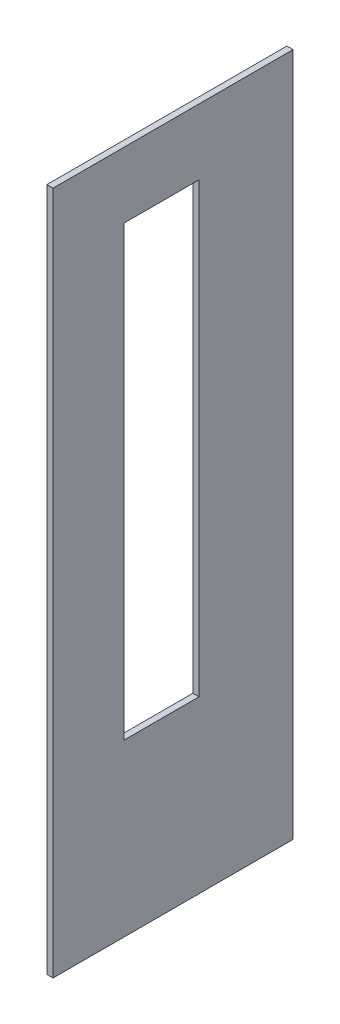
ISO-10303-21;
HEADER;
FILE_DESCRIPTION(('STEP AP214'),'2;1');
FILE_NAME('part.step','',(''),(''),'','','');
FILE_SCHEMA(('AUTOMOTIVE_DESIGN { 1 0 10303 214 1 1 1 1 }'));
ENDSEC;
DATA;
#1=APPLICATION_CONTEXT('core data for automotive mechanical design processes');
#2=APPLICATION_PROTOCOL_DEFINITION('international standard','automotive_design',2000,#1);
#3=PRODUCT_CONTEXT('',#1,'mechanical');
#4=PRODUCT('Part','Part','',(#3));
#5=PRODUCT_RELATED_PRODUCT_CATEGORY('part','',(#4));
#6=PRODUCT_DEFINITION_FORMATION('','',#4);
#7=PRODUCT_DEFINITION_CONTEXT('part definition',#1,'design');
#8=PRODUCT_DEFINITION('design','',#6,#7);
#9=PRODUCT_DEFINITION_SHAPE('','',#8);
#10=(LENGTH_UNIT() NAMED_UNIT(*) SI_UNIT(.MILLI.,.METRE.));
#11=(NAMED_UNIT(*) PLANE_ANGLE_UNIT() SI_UNIT($,.RADIAN.));
#12=(NAMED_UNIT(*) SI_UNIT($,.STERADIAN.) SOLID_ANGLE_UNIT());
#13=UNCERTAINTY_MEASURE_WITH_UNIT(LENGTH_MEASURE(1.E-05),#10,'distance_accuracy_value','');
#14=(GEOMETRIC_REPRESENTATION_CONTEXT(3) GLOBAL_UNCERTAINTY_ASSIGNED_CONTEXT((#13)) GLOBAL_UNIT_ASSIGNED_CONTEXT((#10,
#11,#12)) REPRESENTATION_CONTEXT('',''));
#15=CARTESIAN_POINT('',(0.,0.,0.));
#16=DIRECTION('',(0.,0.,1.));
#17=DIRECTION('',(1.,0.,0.));
#18=AXIS2_PLACEMENT_3D('',#15,#16,#17);
#19=CARTESIAN_POINT('',(1.5,0.,0.));
#20=DIRECTION('',(-1.,0.,0.));
#21=DIRECTION('',(0.,0.,1.));
#22=AXIS2_PLACEMENT_3D('',#19,#20,#21);
#23=PLANE('',#22);
#24=DIRECTION('',(0.,0.,1.));
#25=VECTOR('',#24,1.);
#26=CARTESIAN_POINT('',(1.5,-9.84999999999989,3.40000000000003));
#27=LINE('',#26,#25);
#28=CARTESIAN_POINT('',(1.5,-9.84999999999989,3.40000000000003));
#29=VERTEX_POINT('',#28);
#30=CARTESIAN_POINT('',(1.5,-9.84999999999989,42.25));
#31=VERTEX_POINT('',#30);
#32=EDGE_CURVE('E136',#29,#31,#27,.T.);
#33=ORIENTED_EDGE('',*,*,#32,.F.);
#34=DIRECTION('',(0.,-1.,0.));
#35=VECTOR('',#34,1.);
#36=CARTESIAN_POINT('',(1.5,100.85,3.40000000000002));
#37=LINE('',#36,#35);
#38=CARTESIAN_POINT('',(1.5,100.85,3.40000000000002));
#39=VERTEX_POINT('',#38);
#40=EDGE_CURVE('E146',#39,#29,#37,.T.);
#41=ORIENTED_EDGE('',*,*,#40,.F.);
#42=DIRECTION('',(0.,0.,-1.));
#43=VECTOR('',#42,1.);
#44=CARTESIAN_POINT('',(1.5,100.85,42.25));
#45=LINE('',#44,#43);
#46=CARTESIAN_POINT('',(1.5,100.85,42.25));
#47=VERTEX_POINT('',#46);
#48=EDGE_CURVE('E143',#47,#39,#45,.T.);
#49=ORIENTED_EDGE('',*,*,#48,.F.);
#50=DIRECTION('',(0.,1.,0.));
#51=VECTOR('',#50,1.);
#52=CARTESIAN_POINT('',(1.5,-9.84999999999989,42.25));
#53=LINE('',#52,#51);
#54=EDGE_CURVE('E139',#31,#47,#53,.T.);
#55=ORIENTED_EDGE('',*,*,#54,.F.);
#56=EDGE_LOOP('',(#33,#41,#49,#55));
#57=FACE_BOUND('',#56,.T.);
#58=DIRECTION('',(0.,0.,1.));
#59=VECTOR('',#58,1.);
#60=CARTESIAN_POINT('',(1.5,90.21,0.));
#61=LINE('',#60,#59);
#62=CARTESIAN_POINT('',(1.5,90.21,18.63));
#63=VERTEX_POINT('',#62);
#64=CARTESIAN_POINT('',(1.5,90.21,30.75));
#65=VERTEX_POINT('',#64);
#66=EDGE_CURVE('E101',#63,#65,#61,.T.);
#67=ORIENTED_EDGE('',*,*,#66,.F.);
#68=DIRECTION('',(0.,-1.,0.));
#69=VECTOR('',#68,1.);
#70=CARTESIAN_POINT('',(1.5,0.,18.63));
#71=LINE('',#70,#69);
#72=CARTESIAN_POINT('',(1.5,17.75,18.63));
#73=VERTEX_POINT('',#72);
#74=EDGE_CURVE('E104',#63,#73,#71,.T.);
#75=ORIENTED_EDGE('',*,*,#74,.T.);
#76=DIRECTION('',(0.,0.,1.));
#77=VECTOR('',#76,1.);
#78=CARTESIAN_POINT('',(1.5,17.75,0.));
#79=LINE('',#78,#77);
#80=CARTESIAN_POINT('',(1.5,17.75,30.75));
#81=VERTEX_POINT('',#80);
#82=EDGE_CURVE('E129',#73,#81,#79,.T.);
#83=ORIENTED_EDGE('',*,*,#82,.T.);
#84=DIRECTION('',(0.,-1.,0.));
#85=VECTOR('',#84,1.);
#86=CARTESIAN_POINT('',(1.5,0.,30.75));
#87=LINE('',#86,#85);
#88=EDGE_CURVE('E132',#65,#81,#87,.T.);
#89=ORIENTED_EDGE('',*,*,#88,.F.);
#90=EDGE_LOOP('',(#67,#75,#83,#89));
#91=FACE_BOUND('',#90,.T.);
#92=ADVANCED_FACE('F32',(#57,#91),#23,.F.);
#93=CARTESIAN_POINT('',(0.5,0.,0.));
#94=DIRECTION('',(-1.,0.,0.));
#95=DIRECTION('',(0.,0.,1.));
#96=AXIS2_PLACEMENT_3D('',#93,#94,#95);
#97=PLANE('',#96);
#98=DIRECTION('',(0.,0.,1.));
#99=VECTOR('',#98,1.);
#100=CARTESIAN_POINT('',(0.5,-9.84999999999989,3.40000000000003));
#101=LINE('',#100,#99);
#102=CARTESIAN_POINT('',(0.5,-9.84999999999989,3.40000000000003));
#103=VERTEX_POINT('',#102);
#104=CARTESIAN_POINT('',(0.5,-9.84999999999989,42.25));
#105=VERTEX_POINT('',#104);
#106=EDGE_CURVE('E135',#103,#105,#101,.T.);
#107=ORIENTED_EDGE('',*,*,#106,.T.);
#108=DIRECTION('',(0.,1.,0.));
#109=VECTOR('',#108,1.);
#110=CARTESIAN_POINT('',(0.5,-9.84999999999989,42.25));
#111=LINE('',#110,#109);
#112=CARTESIAN_POINT('',(0.5,100.85,42.25));
#113=VERTEX_POINT('',#112);
#114=EDGE_CURVE('E151',#105,#113,#111,.T.);
#115=ORIENTED_EDGE('',*,*,#114,.T.);
#116=DIRECTION('',(0.,0.,-1.));
#117=VECTOR('',#116,1.);
#118=CARTESIAN_POINT('',(0.5,100.85,42.25));
#119=LINE('',#118,#117);
#120=CARTESIAN_POINT('',(0.5,100.85,3.40000000000002));
#121=VERTEX_POINT('',#120);
#122=EDGE_CURVE('E154',#113,#121,#119,.T.);
#123=ORIENTED_EDGE('',*,*,#122,.T.);
#124=DIRECTION('',(0.,-1.,0.));
#125=VECTOR('',#124,1.);
#126=CARTESIAN_POINT('',(0.5,100.85,3.40000000000002));
#127=LINE('',#126,#125);
#128=EDGE_CURVE('E140',#121,#103,#127,.T.);
#129=ORIENTED_EDGE('',*,*,#128,.T.);
#130=EDGE_LOOP('',(#107,#115,#123,#129));
#131=FACE_BOUND('',#130,.T.);
#132=DIRECTION('',(0.,-1.,0.));
#133=VECTOR('',#132,1.);
#134=CARTESIAN_POINT('',(0.5,90.21,18.63));
#135=LINE('',#134,#133);
#136=CARTESIAN_POINT('',(0.5,90.21,18.63));
#137=VERTEX_POINT('',#136);
#138=CARTESIAN_POINT('',(0.5,17.75,18.63));
#139=VERTEX_POINT('',#138);
#140=EDGE_CURVE('E118',#137,#139,#135,.T.);
#141=ORIENTED_EDGE('',*,*,#140,.F.);
#142=DIRECTION('',(0.,0.,1.));
#143=VECTOR('',#142,1.);
#144=CARTESIAN_POINT('',(0.5,90.21,18.63));
#145=LINE('',#144,#143);
#146=CARTESIAN_POINT('',(0.5,90.21,30.75));
#147=VERTEX_POINT('',#146);
#148=EDGE_CURVE('E57',#137,#147,#145,.T.);
#149=ORIENTED_EDGE('',*,*,#148,.T.);
#150=DIRECTION('',(0.,-1.,0.));
#151=VECTOR('',#150,1.);
#152=CARTESIAN_POINT('',(0.5,90.21,30.75));
#153=LINE('',#152,#151);
#154=CARTESIAN_POINT('',(0.5,17.75,30.75));
#155=VERTEX_POINT('',#154);
#156=EDGE_CURVE('E108',#147,#155,#153,.T.);
#157=ORIENTED_EDGE('',*,*,#156,.T.);
#158=DIRECTION('',(0.,0.,1.));
#159=VECTOR('',#158,1.);
#160=CARTESIAN_POINT('',(0.5,17.75,18.63));
#161=LINE('',#160,#159);
#162=EDGE_CURVE('E114',#139,#155,#161,.T.);
#163=ORIENTED_EDGE('',*,*,#162,.F.);
#164=EDGE_LOOP('',(#141,#149,#157,#163));
#165=FACE_BOUND('',#164,.T.);
#166=ADVANCED_FACE('F117',(#131,#165),#97,.T.);
#167=CARTESIAN_POINT('',(1.5,-9.84999999999989,3.40000000000003));
#168=DIRECTION('',(0.,-1.,0.));
#169=DIRECTION('',(0.,0.,-1.));
#170=AXIS2_PLACEMENT_3D('',#167,#168,#169);
#171=PLANE('',#170);
#172=ORIENTED_EDGE('',*,*,#106,.F.);
#173=DIRECTION('',(-1.,0.,0.));
#174=VECTOR('',#173,1.);
#175=CARTESIAN_POINT('',(1.5,-9.84999999999989,3.40000000000003));
#176=LINE('',#175,#174);
#177=EDGE_CURVE('E11',#29,#103,#176,.T.);
#178=ORIENTED_EDGE('',*,*,#177,.F.);
#179=ORIENTED_EDGE('',*,*,#32,.T.);
#180=DIRECTION('',(-1.,0.,0.));
#181=VECTOR('',#180,1.);
#182=CARTESIAN_POINT('',(1.5,-9.84999999999989,42.25));
#183=LINE('',#182,#181);
#184=EDGE_CURVE('E36',#31,#105,#183,.T.);
#185=ORIENTED_EDGE('',*,*,#184,.T.);
#186=EDGE_LOOP('',(#172,#178,#179,#185));
#187=FACE_BOUND('',#186,.T.);
#188=ADVANCED_FACE('F34',(#187),#171,.T.);
#189=CARTESIAN_POINT('',(1.5,100.85,3.40000000000002));
#190=DIRECTION('',(0.,0.,-1.));
#191=DIRECTION('',(0.,1.,0.));
#192=AXIS2_PLACEMENT_3D('',#189,#190,#191);
#193=PLANE('',#192);
#194=ORIENTED_EDGE('',*,*,#128,.F.);
#195=DIRECTION('',(-1.,0.,0.));
#196=VECTOR('',#195,1.);
#197=CARTESIAN_POINT('',(1.5,100.85,3.40000000000002));
#198=LINE('',#197,#196);
#199=EDGE_CURVE('E41',#39,#121,#198,.T.);
#200=ORIENTED_EDGE('',*,*,#199,.F.);
#201=ORIENTED_EDGE('',*,*,#40,.T.);
#202=ORIENTED_EDGE('',*,*,#177,.T.);
#203=EDGE_LOOP('',(#194,#200,#201,#202));
#204=FACE_BOUND('',#203,.T.);
#205=ADVANCED_FACE('F171',(#204),#193,.T.);
#206=CARTESIAN_POINT('',(1.5,100.85,42.25));
#207=DIRECTION('',(0.,1.,0.));
#208=DIRECTION('',(0.,0.,1.));
#209=AXIS2_PLACEMENT_3D('',#206,#207,#208);
#210=PLANE('',#209);
#211=ORIENTED_EDGE('',*,*,#122,.F.);
#212=DIRECTION('',(-1.,0.,0.));
#213=VECTOR('',#212,1.);
#214=CARTESIAN_POINT('',(1.5,100.85,42.25));
#215=LINE('',#214,#213);
#216=EDGE_CURVE('E159',#47,#113,#215,.T.);
#217=ORIENTED_EDGE('',*,*,#216,.F.);
#218=ORIENTED_EDGE('',*,*,#48,.T.);
#219=ORIENTED_EDGE('',*,*,#199,.T.);
#220=EDGE_LOOP('',(#211,#217,#218,#219));
#221=FACE_BOUND('',#220,.T.);
#222=ADVANCED_FACE('F177',(#221),#210,.T.);
#223=CARTESIAN_POINT('',(1.5,-9.84999999999989,42.25));
#224=DIRECTION('',(0.,0.,1.));
#225=DIRECTION('',(0.,-1.,0.));
#226=AXIS2_PLACEMENT_3D('',#223,#224,#225);
#227=PLANE('',#226);
#228=ORIENTED_EDGE('',*,*,#114,.F.);
#229=ORIENTED_EDGE('',*,*,#184,.F.);
#230=ORIENTED_EDGE('',*,*,#54,.T.);
#231=ORIENTED_EDGE('',*,*,#216,.T.);
#232=EDGE_LOOP('',(#228,#229,#230,#231));
#233=FACE_BOUND('',#232,.T.);
#234=ADVANCED_FACE('F167',(#233),#227,.T.);
#235=CARTESIAN_POINT('',(10.5,90.21,18.63));
#236=DIRECTION('',(0.,-1.,0.));
#237=DIRECTION('',(0.,0.,-1.));
#238=AXIS2_PLACEMENT_3D('',#235,#236,#237);
#239=PLANE('',#238);
#240=ORIENTED_EDGE('',*,*,#66,.T.);
#241=DIRECTION('',(-1.,0.,0.));
#242=VECTOR('',#241,1.);
#243=CARTESIAN_POINT('',(10.5,90.21,30.75));
#244=LINE('',#243,#242);
#245=EDGE_CURVE('E97',#65,#147,#244,.T.);
#246=ORIENTED_EDGE('',*,*,#245,.T.);
#247=ORIENTED_EDGE('',*,*,#148,.F.);
#248=DIRECTION('',(-1.,0.,0.));
#249=VECTOR('',#248,1.);
#250=CARTESIAN_POINT('',(10.5,90.21,18.63));
#251=LINE('',#250,#249);
#252=EDGE_CURVE('E123',#63,#137,#251,.T.);
#253=ORIENTED_EDGE('',*,*,#252,.F.);
#254=EDGE_LOOP('',(#240,#246,#247,#253));
#255=FACE_BOUND('',#254,.T.);
#256=ADVANCED_FACE('F99',(#255),#239,.T.);
#257=CARTESIAN_POINT('',(10.5,90.21,30.75));
#258=DIRECTION('',(0.,0.,-1.));
#259=DIRECTION('',(0.,1.,0.));
#260=AXIS2_PLACEMENT_3D('',#257,#258,#259);
#261=PLANE('',#260);
#262=ORIENTED_EDGE('',*,*,#88,.T.);
#263=DIRECTION('',(-1.,0.,0.));
#264=VECTOR('',#263,1.);
#265=CARTESIAN_POINT('',(10.5,17.75,30.75));
#266=LINE('',#265,#264);
#267=EDGE_CURVE('E105',#81,#155,#266,.T.);
#268=ORIENTED_EDGE('',*,*,#267,.T.);
#269=ORIENTED_EDGE('',*,*,#156,.F.);
#270=ORIENTED_EDGE('',*,*,#245,.F.);
#271=EDGE_LOOP('',(#262,#268,#269,#270));
#272=FACE_BOUND('',#271,.T.);
#273=ADVANCED_FACE('F109',(#272),#261,.T.);
#274=CARTESIAN_POINT('',(10.5,17.75,18.63));
#275=DIRECTION('',(0.,-1.,0.));
#276=DIRECTION('',(0.,0.,-1.));
#277=AXIS2_PLACEMENT_3D('',#274,#275,#276);
#278=PLANE('',#277);
#279=DIRECTION('',(-1.,0.,0.));
#280=VECTOR('',#279,1.);
#281=CARTESIAN_POINT('',(10.5,17.75,18.63));
#282=LINE('',#281,#280);
#283=EDGE_CURVE('E49',#73,#139,#282,.T.);
#284=ORIENTED_EDGE('',*,*,#283,.T.);
#285=ORIENTED_EDGE('',*,*,#162,.T.);
#286=ORIENTED_EDGE('',*,*,#267,.F.);
#287=ORIENTED_EDGE('',*,*,#82,.F.);
#288=EDGE_LOOP('',(#284,#285,#286,#287));
#289=FACE_BOUND('',#288,.T.);
#290=ADVANCED_FACE('F196',(#289),#278,.F.);
#291=CARTESIAN_POINT('',(10.5,90.21,18.63));
#292=DIRECTION('',(0.,0.,-1.));
#293=DIRECTION('',(0.,1.,0.));
#294=AXIS2_PLACEMENT_3D('',#291,#292,#293);
#295=PLANE('',#294);
#296=ORIENTED_EDGE('',*,*,#252,.T.);
#297=ORIENTED_EDGE('',*,*,#140,.T.);
#298=ORIENTED_EDGE('',*,*,#283,.F.);
#299=ORIENTED_EDGE('',*,*,#74,.F.);
#300=EDGE_LOOP('',(#296,#297,#298,#299));
#301=FACE_BOUND('',#300,.T.);
#302=ADVANCED_FACE('F199',(#301),#295,.F.);
#303=CLOSED_SHELL('',(#92,#166,#188,#205,#222,#234,#256,#273,#290,#302));
#304=MANIFOLD_SOLID_BREP('B2',#303);
#305=ADVANCED_BREP_SHAPE_REPRESENTATION('',(#18,#304),#14);
#306=SHAPE_DEFINITION_REPRESENTATION(#9,#305);
ENDSEC;
END-ISO-10303-21;
